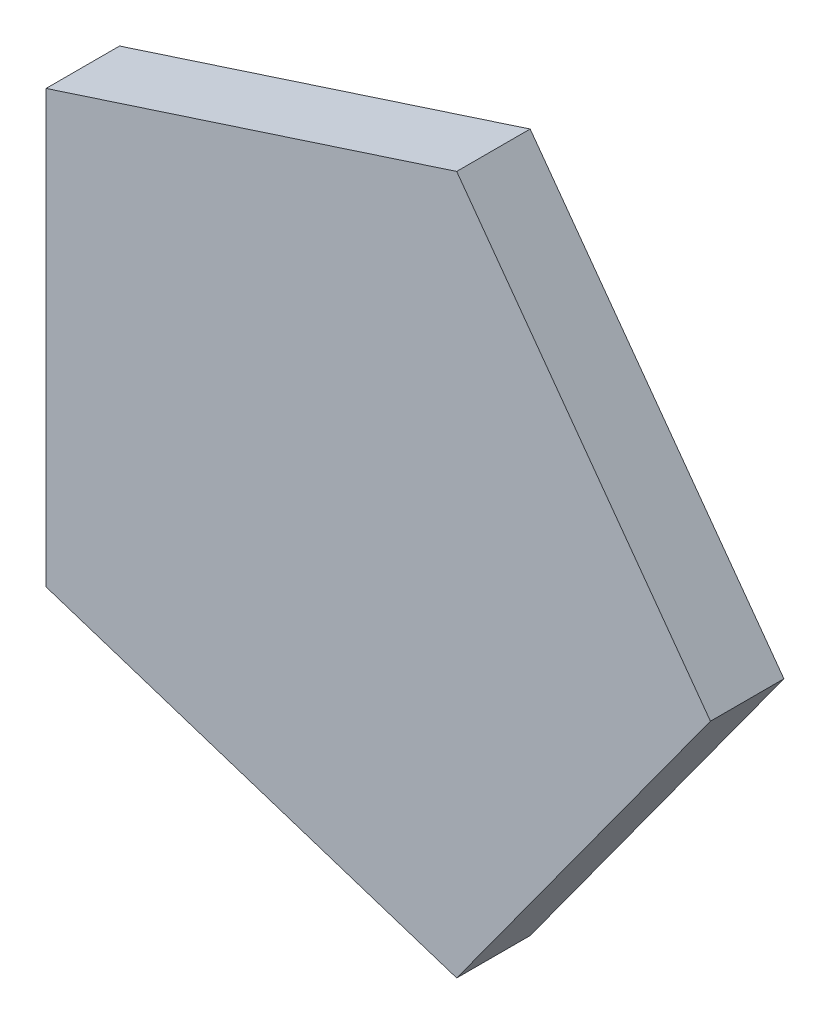
ISO-10303-21;
HEADER;
FILE_DESCRIPTION(('STEP AP214'),'2;1');
FILE_NAME('part.step','',(''),(''),'','','');
FILE_SCHEMA(('AUTOMOTIVE_DESIGN { 1 0 10303 214 1 1 1 1 }'));
ENDSEC;
DATA;
#1=APPLICATION_CONTEXT('core data for automotive mechanical design processes');
#2=APPLICATION_PROTOCOL_DEFINITION('international standard','automotive_design',2000,#1);
#3=PRODUCT_CONTEXT('',#1,'mechanical');
#4=PRODUCT('Part','Part','',(#3));
#5=PRODUCT_RELATED_PRODUCT_CATEGORY('part','',(#4));
#6=PRODUCT_DEFINITION_FORMATION('','',#4);
#7=PRODUCT_DEFINITION_CONTEXT('part definition',#1,'design');
#8=PRODUCT_DEFINITION('design','',#6,#7);
#9=PRODUCT_DEFINITION_SHAPE('','',#8);
#10=(LENGTH_UNIT() NAMED_UNIT(*) SI_UNIT(.MILLI.,.METRE.));
#11=(NAMED_UNIT(*) PLANE_ANGLE_UNIT() SI_UNIT($,.RADIAN.));
#12=(NAMED_UNIT(*) SI_UNIT($,.STERADIAN.) SOLID_ANGLE_UNIT());
#13=UNCERTAINTY_MEASURE_WITH_UNIT(LENGTH_MEASURE(1.E-05),#10,'distance_accuracy_value','');
#14=(GEOMETRIC_REPRESENTATION_CONTEXT(3) GLOBAL_UNCERTAINTY_ASSIGNED_CONTEXT((#13)) GLOBAL_UNIT_ASSIGNED_CONTEXT((#10,
#11,#12)) REPRESENTATION_CONTEXT('',''));
#15=CARTESIAN_POINT('',(0.,0.,0.));
#16=DIRECTION('',(0.,0.,1.));
#17=DIRECTION('',(1.,0.,0.));
#18=AXIS2_PLACEMENT_3D('',#15,#16,#17);
#19=CARTESIAN_POINT('',(154.508497187474,-475.528258147576,100.));
#20=DIRECTION('',(-0.809016994374948,0.587785252292472,0.));
#21=DIRECTION('',(-0.587785252292472,-0.809016994374948,0.));
#22=AXIS2_PLACEMENT_3D('',#19,#20,#21);
#23=PLANE('',#22);
#24=DIRECTION('',(0.587785252292472,0.809016994374948,0.));
#25=VECTOR('',#24,1.);
#26=CARTESIAN_POINT('',(154.508497187474,-475.528258147576,0.));
#27=LINE('',#26,#25);
#28=CARTESIAN_POINT('',(154.508497187474,-475.528258147576,0.));
#29=VERTEX_POINT('',#28);
#30=CARTESIAN_POINT('',(500.,6.10622663543836E-13,0.));
#31=VERTEX_POINT('',#30);
#32=EDGE_CURVE('E115',#29,#31,#27,.T.);
#33=ORIENTED_EDGE('',*,*,#32,.T.);
#34=DIRECTION('',(0.,0.,-1.));
#35=VECTOR('',#34,1.);
#36=CARTESIAN_POINT('',(500.,6.10622663543836E-13,100.));
#37=LINE('',#36,#35);
#38=CARTESIAN_POINT('',(500.,6.10622663543836E-13,100.));
#39=VERTEX_POINT('',#38);
#40=EDGE_CURVE('E11',#39,#31,#37,.T.);
#41=ORIENTED_EDGE('',*,*,#40,.F.);
#42=DIRECTION('',(0.587785252292472,0.809016994374948,0.));
#43=VECTOR('',#42,1.);
#44=CARTESIAN_POINT('',(154.508497187474,-475.528258147576,100.));
#45=LINE('',#44,#43);
#46=CARTESIAN_POINT('',(154.508497187474,-475.528258147576,100.));
#47=VERTEX_POINT('',#46);
#48=EDGE_CURVE('E123',#47,#39,#45,.T.);
#49=ORIENTED_EDGE('',*,*,#48,.F.);
#50=DIRECTION('',(0.,0.,-1.));
#51=VECTOR('',#50,1.);
#52=CARTESIAN_POINT('',(154.508497187474,-475.528258147576,100.));
#53=LINE('',#52,#51);
#54=EDGE_CURVE('E111',#47,#29,#53,.T.);
#55=ORIENTED_EDGE('',*,*,#54,.T.);
#56=EDGE_LOOP('',(#33,#41,#49,#55));
#57=FACE_BOUND('',#56,.T.);
#58=ADVANCED_FACE('F41',(#57),#23,.F.);
#59=CARTESIAN_POINT('',(500.,6.10622663543836E-13,100.));
#60=DIRECTION('',(-0.809016994374947,-0.587785252292474,0.));
#61=DIRECTION('',(0.587785252292474,-0.809016994374947,0.));
#62=AXIS2_PLACEMENT_3D('',#59,#60,#61);
#63=PLANE('',#62);
#64=DIRECTION('',(-0.587785252292474,0.809016994374947,0.));
#65=VECTOR('',#64,1.);
#66=CARTESIAN_POINT('',(500.,6.10622663543836E-13,0.));
#67=LINE('',#66,#65);
#68=CARTESIAN_POINT('',(154.508497187473,475.528258147577,0.));
#69=VERTEX_POINT('',#68);
#70=EDGE_CURVE('E118',#31,#69,#67,.T.);
#71=ORIENTED_EDGE('',*,*,#70,.T.);
#72=DIRECTION('',(0.,0.,-1.));
#73=VECTOR('',#72,1.);
#74=CARTESIAN_POINT('',(154.508497187473,475.528258147577,100.));
#75=LINE('',#74,#73);
#76=CARTESIAN_POINT('',(154.508497187473,475.528258147577,100.));
#77=VERTEX_POINT('',#76);
#78=EDGE_CURVE('E49',#77,#69,#75,.T.);
#79=ORIENTED_EDGE('',*,*,#78,.F.);
#80=DIRECTION('',(-0.587785252292474,0.809016994374947,0.));
#81=VECTOR('',#80,1.);
#82=CARTESIAN_POINT('',(500.,6.10622663543836E-13,100.));
#83=LINE('',#82,#81);
#84=EDGE_CURVE('E91',#39,#77,#83,.T.);
#85=ORIENTED_EDGE('',*,*,#84,.F.);
#86=ORIENTED_EDGE('',*,*,#40,.T.);
#87=EDGE_LOOP('',(#71,#79,#85,#86));
#88=FACE_BOUND('',#87,.T.);
#89=ADVANCED_FACE('F142',(#88),#63,.F.);
#90=CARTESIAN_POINT('',(154.508497187473,475.528258147577,100.));
#91=DIRECTION('',(0.309016994374949,-0.951056516295153,0.));
#92=DIRECTION('',(0.951056516295153,0.309016994374949,0.));
#93=AXIS2_PLACEMENT_3D('',#90,#91,#92);
#94=PLANE('',#93);
#95=DIRECTION('',(-0.951056516295153,-0.309016994374949,0.));
#96=VECTOR('',#95,1.);
#97=CARTESIAN_POINT('',(154.508497187473,475.528258147577,0.));
#98=LINE('',#97,#96);
#99=CARTESIAN_POINT('',(-404.508497187474,293.892626146236,0.));
#100=VERTEX_POINT('',#99);
#101=EDGE_CURVE('E106',#69,#100,#98,.T.);
#102=ORIENTED_EDGE('',*,*,#101,.T.);
#103=DIRECTION('',(0.,0.,-1.));
#104=VECTOR('',#103,1.);
#105=CARTESIAN_POINT('',(-404.508497187474,293.892626146236,100.));
#106=LINE('',#105,#104);
#107=CARTESIAN_POINT('',(-404.508497187474,293.892626146236,100.));
#108=VERTEX_POINT('',#107);
#109=EDGE_CURVE('E103',#108,#100,#106,.T.);
#110=ORIENTED_EDGE('',*,*,#109,.F.);
#111=DIRECTION('',(-0.951056516295153,-0.309016994374949,0.));
#112=VECTOR('',#111,1.);
#113=CARTESIAN_POINT('',(154.508497187473,475.528258147577,100.));
#114=LINE('',#113,#112);
#115=EDGE_CURVE('E95',#77,#108,#114,.T.);
#116=ORIENTED_EDGE('',*,*,#115,.F.);
#117=ORIENTED_EDGE('',*,*,#78,.T.);
#118=EDGE_LOOP('',(#102,#110,#116,#117));
#119=FACE_BOUND('',#118,.T.);
#120=ADVANCED_FACE('F104',(#119),#94,.F.);
#121=CARTESIAN_POINT('',(-404.508497187474,293.892626146236,100.));
#122=DIRECTION('',(1.,0.,0.));
#123=DIRECTION('',(0.,1.,0.));
#124=AXIS2_PLACEMENT_3D('',#121,#122,#123);
#125=PLANE('',#124);
#126=DIRECTION('',(0.,-1.,0.));
#127=VECTOR('',#126,1.);
#128=CARTESIAN_POINT('',(-404.508497187474,293.892626146236,0.));
#129=LINE('',#128,#127);
#130=CARTESIAN_POINT('',(-404.508497187473,-293.892626146237,0.));
#131=VERTEX_POINT('',#130);
#132=EDGE_CURVE('E77',#100,#131,#129,.T.);
#133=ORIENTED_EDGE('',*,*,#132,.T.);
#134=DIRECTION('',(0.,0.,-1.));
#135=VECTOR('',#134,1.);
#136=CARTESIAN_POINT('',(-404.508497187473,-293.892626146237,100.));
#137=LINE('',#136,#135);
#138=CARTESIAN_POINT('',(-404.508497187473,-293.892626146237,100.));
#139=VERTEX_POINT('',#138);
#140=EDGE_CURVE('E107',#139,#131,#137,.T.);
#141=ORIENTED_EDGE('',*,*,#140,.F.);
#142=DIRECTION('',(0.,-1.,0.));
#143=VECTOR('',#142,1.);
#144=CARTESIAN_POINT('',(-404.508497187474,293.892626146236,100.));
#145=LINE('',#144,#143);
#146=EDGE_CURVE('E99',#108,#139,#145,.T.);
#147=ORIENTED_EDGE('',*,*,#146,.F.);
#148=ORIENTED_EDGE('',*,*,#109,.T.);
#149=EDGE_LOOP('',(#133,#141,#147,#148));
#150=FACE_BOUND('',#149,.T.);
#151=ADVANCED_FACE('F109',(#150),#125,.F.);
#152=CARTESIAN_POINT('',(-404.508497187473,-293.892626146237,100.));
#153=DIRECTION('',(0.309016994374946,0.951056516295154,0.));
#154=DIRECTION('',(-0.951056516295154,0.309016994374946,0.));
#155=AXIS2_PLACEMENT_3D('',#152,#153,#154);
#156=PLANE('',#155);
#157=DIRECTION('',(0.951056516295154,-0.309016994374946,0.));
#158=VECTOR('',#157,1.);
#159=CARTESIAN_POINT('',(-404.508497187473,-293.892626146237,0.));
#160=LINE('',#159,#158);
#161=EDGE_CURVE('E83',#131,#29,#160,.T.);
#162=ORIENTED_EDGE('',*,*,#161,.T.);
#163=ORIENTED_EDGE('',*,*,#54,.F.);
#164=DIRECTION('',(0.951056516295154,-0.309016994374946,0.));
#165=VECTOR('',#164,1.);
#166=CARTESIAN_POINT('',(-404.508497187473,-293.892626146237,100.));
#167=LINE('',#166,#165);
#168=EDGE_CURVE('E57',#139,#47,#167,.T.);
#169=ORIENTED_EDGE('',*,*,#168,.F.);
#170=ORIENTED_EDGE('',*,*,#140,.T.);
#171=EDGE_LOOP('',(#162,#163,#169,#170));
#172=FACE_BOUND('',#171,.T.);
#173=ADVANCED_FACE('F131',(#172),#156,.F.);
#174=CARTESIAN_POINT('',(0.,0.,100.));
#175=DIRECTION('',(0.,0.,1.));
#176=DIRECTION('',(1.,0.,0.));
#177=AXIS2_PLACEMENT_3D('',#174,#175,#176);
#178=PLANE('',#177);
#179=ORIENTED_EDGE('',*,*,#48,.T.);
#180=ORIENTED_EDGE('',*,*,#84,.T.);
#181=ORIENTED_EDGE('',*,*,#115,.T.);
#182=ORIENTED_EDGE('',*,*,#146,.T.);
#183=ORIENTED_EDGE('',*,*,#168,.T.);
#184=EDGE_LOOP('',(#179,#180,#181,#182,#183));
#185=FACE_BOUND('',#184,.T.);
#186=ADVANCED_FACE('F97',(#185),#178,.T.);
#187=CARTESIAN_POINT('',(0.,0.,0.));
#188=DIRECTION('',(0.,0.,1.));
#189=DIRECTION('',(1.,0.,0.));
#190=AXIS2_PLACEMENT_3D('',#187,#188,#189);
#191=PLANE('',#190);
#192=ORIENTED_EDGE('',*,*,#32,.F.);
#193=ORIENTED_EDGE('',*,*,#161,.F.);
#194=ORIENTED_EDGE('',*,*,#132,.F.);
#195=ORIENTED_EDGE('',*,*,#101,.F.);
#196=ORIENTED_EDGE('',*,*,#70,.F.);
#197=EDGE_LOOP('',(#192,#193,#194,#195,#196));
#198=FACE_BOUND('',#197,.T.);
#199=ADVANCED_FACE('F127',(#198),#191,.F.);
#200=CLOSED_SHELL('',(#58,#89,#120,#151,#173,#186,#199));
#201=MANIFOLD_SOLID_BREP('B2',#200);
#202=ADVANCED_BREP_SHAPE_REPRESENTATION('',(#18,#201),#14);
#203=SHAPE_DEFINITION_REPRESENTATION(#9,#202);
ENDSEC;
END-ISO-10303-21;
